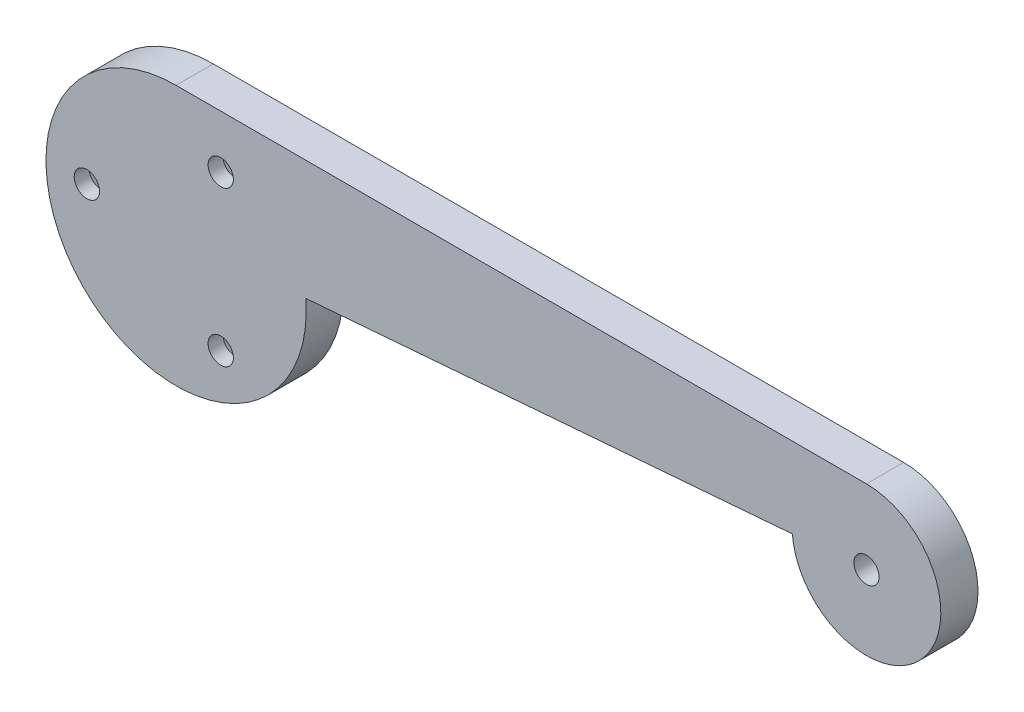
ISO-10303-21;
HEADER;
FILE_DESCRIPTION(('STEP AP214'),'2;1');
FILE_NAME('part.step','',(''),(''),'','','');
FILE_SCHEMA(('AUTOMOTIVE_DESIGN { 1 0 10303 214 1 1 1 1 }'));
ENDSEC;
DATA;
#1=APPLICATION_CONTEXT('core data for automotive mechanical design processes');
#2=APPLICATION_PROTOCOL_DEFINITION('international standard','automotive_design',2000,#1);
#3=PRODUCT_CONTEXT('',#1,'mechanical');
#4=PRODUCT('Part','Part','',(#3));
#5=PRODUCT_RELATED_PRODUCT_CATEGORY('part','',(#4));
#6=PRODUCT_DEFINITION_FORMATION('','',#4);
#7=PRODUCT_DEFINITION_CONTEXT('part definition',#1,'design');
#8=PRODUCT_DEFINITION('design','',#6,#7);
#9=PRODUCT_DEFINITION_SHAPE('','',#8);
#10=(LENGTH_UNIT() NAMED_UNIT(*) SI_UNIT(.MILLI.,.METRE.));
#11=(NAMED_UNIT(*) PLANE_ANGLE_UNIT() SI_UNIT($,.RADIAN.));
#12=(NAMED_UNIT(*) SI_UNIT($,.STERADIAN.) SOLID_ANGLE_UNIT());
#13=UNCERTAINTY_MEASURE_WITH_UNIT(LENGTH_MEASURE(1.E-05),#10,'distance_accuracy_value','');
#14=(GEOMETRIC_REPRESENTATION_CONTEXT(3) GLOBAL_UNCERTAINTY_ASSIGNED_CONTEXT((#13)) GLOBAL_UNIT_ASSIGNED_CONTEXT((#10,
#11,#12)) REPRESENTATION_CONTEXT('',''));
#15=CARTESIAN_POINT('',(0.,0.,0.));
#16=DIRECTION('',(0.,0.,1.));
#17=DIRECTION('',(1.,0.,0.));
#18=AXIS2_PLACEMENT_3D('',#15,#16,#17);
#19=CARTESIAN_POINT('',(0.,0.,0.));
#20=DIRECTION('',(0.,0.,1.));
#21=DIRECTION('',(1.,0.,0.));
#22=AXIS2_PLACEMENT_3D('',#19,#20,#21);
#23=PLANE('',#22);
#24=CARTESIAN_POINT('',(92.8256871756229,7.5,0.));
#25=DIRECTION('',(0.,0.,1.));
#26=DIRECTION('',(1.,0.,0.));
#27=AXIS2_PLACEMENT_3D('',#24,#25,#26);
#28=CIRCLE('',#27,1.69999999999999);
#29=CARTESIAN_POINT('',(94.5256871756229,7.5,0.));
#30=VERTEX_POINT('',#29);
#31=EDGE_CURVE('E473',#30,#30,#28,.T.);
#32=ORIENTED_EDGE('',*,*,#31,.T.);
#33=EDGE_LOOP('',(#32));
#34=FACE_BOUND('',#33,.T.);
#35=DIRECTION('',(1.,0.,0.));
#36=VECTOR('',#35,1.);
#37=CARTESIAN_POINT('',(4.38341924626908,7.59230484541324,0.));
#38=LINE('',#37,#36);
#39=CARTESIAN_POINT('',(4.38341924626908,7.59230484541324,0.));
#40=VERTEX_POINT('',#39);
#41=CARTESIAN_POINT('',(7.61658075373099,7.59230484541323,0.));
#42=VERTEX_POINT('',#41);
#43=EDGE_CURVE('E58',#40,#42,#38,.T.);
#44=ORIENTED_EDGE('',*,*,#43,.T.);
#45=DIRECTION('',(0.500000000000004,0.866025403784436,0.));
#46=VECTOR('',#45,1.);
#47=CARTESIAN_POINT('',(7.61658075373099,7.59230484541323,0.));
#48=LINE('',#47,#46);
#49=CARTESIAN_POINT('',(9.23316150746195,10.3923048454132,0.));
#50=VERTEX_POINT('',#49);
#51=EDGE_CURVE('E231',#42,#50,#48,.T.);
#52=ORIENTED_EDGE('',*,*,#51,.T.);
#53=DIRECTION('',(-0.499999999999996,0.866025403784441,0.));
#54=VECTOR('',#53,1.);
#55=CARTESIAN_POINT('',(9.23316150746195,10.3923048454132,0.));
#56=LINE('',#55,#54);
#57=CARTESIAN_POINT('',(7.61658075373101,13.1923048454132,0.));
#58=VERTEX_POINT('',#57);
#59=EDGE_CURVE('E234',#50,#58,#56,.T.);
#60=ORIENTED_EDGE('',*,*,#59,.T.);
#61=DIRECTION('',(-1.,0.,0.));
#62=VECTOR('',#61,1.);
#63=CARTESIAN_POINT('',(7.61658075373101,13.1923048454132,0.));
#64=LINE('',#63,#62);
#65=CARTESIAN_POINT('',(4.38341924626911,13.1923048454132,0.));
#66=VERTEX_POINT('',#65);
#67=EDGE_CURVE('E237',#58,#66,#64,.T.);
#68=ORIENTED_EDGE('',*,*,#67,.T.);
#69=DIRECTION('',(-0.500000000000004,-0.866025403784436,0.));
#70=VECTOR('',#69,1.);
#71=CARTESIAN_POINT('',(4.38341924626911,13.1923048454132,0.));
#72=LINE('',#71,#70);
#73=CARTESIAN_POINT('',(2.76683849253814,10.3923048454133,0.));
#74=VERTEX_POINT('',#73);
#75=EDGE_CURVE('E240',#66,#74,#72,.T.);
#76=ORIENTED_EDGE('',*,*,#75,.T.);
#77=DIRECTION('',(0.499999999999995,-0.866025403784441,0.));
#78=VECTOR('',#77,1.);
#79=CARTESIAN_POINT('',(2.76683849253814,10.3923048454133,0.));
#80=LINE('',#79,#78);
#81=EDGE_CURVE('E219',#74,#40,#80,.T.);
#82=ORIENTED_EDGE('',*,*,#81,.T.);
#83=EDGE_LOOP('',(#44,#52,#60,#68,#76,#82));
#84=FACE_BOUND('',#83,.T.);
#85=CARTESIAN_POINT('',(0.,0.,0.));
#86=DIRECTION('',(0.,0.,1.));
#87=DIRECTION('',(1.,0.,0.));
#88=AXIS2_PLACEMENT_3D('',#85,#86,#87);
#89=CIRCLE('',#88,17.5);
#90=CARTESIAN_POINT('',(0.,17.5,0.));
#91=VERTEX_POINT('',#90);
#92=CARTESIAN_POINT('',(17.4431573607474,1.40934782371281,0.));
#93=VERTEX_POINT('',#92);
#94=EDGE_CURVE('E312',#91,#93,#89,.T.);
#95=ORIENTED_EDGE('',*,*,#94,.F.);
#96=DIRECTION('',(-1.,0.,0.));
#97=VECTOR('',#96,1.);
#98=CARTESIAN_POINT('',(0.,17.5,0.));
#99=LINE('',#98,#97);
#100=CARTESIAN_POINT('',(92.8256871756229,17.5,0.));
#101=VERTEX_POINT('',#100);
#102=EDGE_CURVE('E317',#101,#91,#99,.T.);
#103=ORIENTED_EDGE('',*,*,#102,.F.);
#104=CARTESIAN_POINT('',(92.8256871756229,7.5,0.));
#105=DIRECTION('',(0.,0.,1.));
#106=DIRECTION('',(-1.,0.,0.));
#107=AXIS2_PLACEMENT_3D('',#104,#105,#106);
#108=CIRCLE('',#107,10.);
#109=CARTESIAN_POINT('',(82.8581686837672,6.69465838644989,0.));
#110=VERTEX_POINT('',#109);
#111=EDGE_CURVE('E328',#110,#101,#108,.T.);
#112=ORIENTED_EDGE('',*,*,#111,.F.);
#113=DIRECTION('',(0.996751849185565,0.0805341613550145,0.));
#114=VECTOR('',#113,1.);
#115=CARTESIAN_POINT('',(17.4431573607474,1.40934782371281,0.));
#116=LINE('',#115,#114);
#117=EDGE_CURVE('E326',#93,#110,#116,.T.);
#118=ORIENTED_EDGE('',*,*,#117,.F.);
#119=EDGE_LOOP('',(#95,#103,#112,#118));
#120=FACE_BOUND('',#119,.T.);
#121=DIRECTION('',(-0.500000000000001,0.866025403784438,0.));
#122=VECTOR('',#121,1.);
#123=CARTESIAN_POINT('',(-8.76683849253809,0.,0.));
#124=LINE('',#123,#122);
#125=CARTESIAN_POINT('',(-8.76683849253809,0.,0.));
#126=VERTEX_POINT('',#125);
#127=CARTESIAN_POINT('',(-10.383419246269,2.8,0.));
#128=VERTEX_POINT('',#127);
#129=EDGE_CURVE('E263',#126,#128,#124,.T.);
#130=ORIENTED_EDGE('',*,*,#129,.T.);
#131=DIRECTION('',(-1.,0.,0.));
#132=VECTOR('',#131,1.);
#133=CARTESIAN_POINT('',(-10.383419246269,2.8,0.));
#134=LINE('',#133,#132);
#135=CARTESIAN_POINT('',(-13.616580753731,2.8,0.));
#136=VERTEX_POINT('',#135);
#137=EDGE_CURVE('E281',#128,#136,#134,.T.);
#138=ORIENTED_EDGE('',*,*,#137,.T.);
#139=DIRECTION('',(-0.5,-0.866025403784438,0.));
#140=VECTOR('',#139,1.);
#141=CARTESIAN_POINT('',(-13.616580753731,2.8,0.));
#142=LINE('',#141,#140);
#143=CARTESIAN_POINT('',(-15.2331615074619,0.,0.));
#144=VERTEX_POINT('',#143);
#145=EDGE_CURVE('E284',#136,#144,#142,.T.);
#146=ORIENTED_EDGE('',*,*,#145,.T.);
#147=DIRECTION('',(0.5,-0.866025403784438,0.));
#148=VECTOR('',#147,1.);
#149=CARTESIAN_POINT('',(-15.2331615074619,0.,0.));
#150=LINE('',#149,#148);
#151=CARTESIAN_POINT('',(-13.616580753731,-2.8,0.));
#152=VERTEX_POINT('',#151);
#153=EDGE_CURVE('E287',#144,#152,#150,.T.);
#154=ORIENTED_EDGE('',*,*,#153,.T.);
#155=DIRECTION('',(1.,0.,0.));
#156=VECTOR('',#155,1.);
#157=CARTESIAN_POINT('',(-13.616580753731,-2.8,0.));
#158=LINE('',#157,#156);
#159=CARTESIAN_POINT('',(-10.383419246269,-2.8,0.));
#160=VERTEX_POINT('',#159);
#161=EDGE_CURVE('E290',#152,#160,#158,.T.);
#162=ORIENTED_EDGE('',*,*,#161,.T.);
#163=DIRECTION('',(0.500000000000001,0.866025403784438,0.));
#164=VECTOR('',#163,1.);
#165=CARTESIAN_POINT('',(-10.383419246269,-2.8,0.));
#166=LINE('',#165,#164);
#167=EDGE_CURVE('E268',#160,#126,#166,.T.);
#168=ORIENTED_EDGE('',*,*,#167,.T.);
#169=EDGE_LOOP('',(#130,#138,#146,#154,#162,#168));
#170=FACE_BOUND('',#169,.T.);
#171=DIRECTION('',(-0.500000000000008,-0.866025403784434,0.));
#172=VECTOR('',#171,1.);
#173=CARTESIAN_POINT('',(4.38341924626897,-7.5923048454133,0.));
#174=LINE('',#173,#172);
#175=CARTESIAN_POINT('',(4.38341924626897,-7.5923048454133,0.));
#176=VERTEX_POINT('',#175);
#177=CARTESIAN_POINT('',(2.766838492538,-10.3923048454133,0.));
#178=VERTEX_POINT('',#177);
#179=EDGE_CURVE('E50',#176,#178,#174,.T.);
#180=ORIENTED_EDGE('',*,*,#179,.T.);
#181=DIRECTION('',(0.499999999999992,-0.866025403784443,0.));
#182=VECTOR('',#181,1.);
#183=CARTESIAN_POINT('',(2.766838492538,-10.3923048454133,0.));
#184=LINE('',#183,#182);
#185=CARTESIAN_POINT('',(4.38341924626893,-13.1923048454133,0.));
#186=VERTEX_POINT('',#185);
#187=EDGE_CURVE('E207',#178,#186,#184,.T.);
#188=ORIENTED_EDGE('',*,*,#187,.T.);
#189=DIRECTION('',(1.,0.,0.));
#190=VECTOR('',#189,1.);
#191=CARTESIAN_POINT('',(4.38341924626893,-13.1923048454133,0.));
#192=LINE('',#191,#190);
#193=CARTESIAN_POINT('',(7.61658075373083,-13.1923048454133,0.));
#194=VERTEX_POINT('',#193);
#195=EDGE_CURVE('E475',#186,#194,#192,.T.);
#196=ORIENTED_EDGE('',*,*,#195,.T.);
#197=DIRECTION('',(0.500000000000008,0.866025403784434,0.));
#198=VECTOR('',#197,1.);
#199=CARTESIAN_POINT('',(7.61658075373083,-13.1923048454133,0.));
#200=LINE('',#199,#198);
#201=CARTESIAN_POINT('',(9.23316150746181,-10.3923048454134,0.));
#202=VERTEX_POINT('',#201);
#203=EDGE_CURVE('E483',#194,#202,#200,.T.);
#204=ORIENTED_EDGE('',*,*,#203,.T.);
#205=DIRECTION('',(-0.499999999999992,0.866025403784443,0.));
#206=VECTOR('',#205,1.);
#207=CARTESIAN_POINT('',(9.23316150746181,-10.3923048454134,0.));
#208=LINE('',#207,#206);
#209=CARTESIAN_POINT('',(7.61658075373088,-7.59230484541333,0.));
#210=VERTEX_POINT('',#209);
#211=EDGE_CURVE('E486',#202,#210,#208,.T.);
#212=ORIENTED_EDGE('',*,*,#211,.T.);
#213=DIRECTION('',(-1.,0.,0.));
#214=VECTOR('',#213,1.);
#215=CARTESIAN_POINT('',(7.61658075373088,-7.59230484541333,0.));
#216=LINE('',#215,#214);
#217=EDGE_CURVE('E203',#210,#176,#216,.T.);
#218=ORIENTED_EDGE('',*,*,#217,.T.);
#219=EDGE_LOOP('',(#180,#188,#196,#204,#212,#218));
#220=FACE_BOUND('',#219,.T.);
#221=ADVANCED_FACE('F33',(#34,#84,#120,#170,#220),#23,.F.);
#222=CARTESIAN_POINT('',(0.,0.,5.));
#223=DIRECTION('',(0.,0.,-1.));
#224=DIRECTION('',(-1.,0.,0.));
#225=AXIS2_PLACEMENT_3D('',#222,#223,#224);
#226=CYLINDRICAL_SURFACE('',#225,17.5);
#227=ORIENTED_EDGE('',*,*,#94,.T.);
#228=DIRECTION('',(0.,0.,-1.));
#229=VECTOR('',#228,1.);
#230=CARTESIAN_POINT('',(17.4431573607474,1.40934782371281,5.));
#231=LINE('',#230,#229);
#232=CARTESIAN_POINT('',(17.4431573607474,1.40934782371281,5.));
#233=VERTEX_POINT('',#232);
#234=EDGE_CURVE('E11',#233,#93,#231,.T.);
#235=ORIENTED_EDGE('',*,*,#234,.F.);
#236=CARTESIAN_POINT('',(0.,0.,5.));
#237=DIRECTION('',(0.,0.,1.));
#238=DIRECTION('',(1.,0.,0.));
#239=AXIS2_PLACEMENT_3D('',#236,#237,#238);
#240=CIRCLE('',#239,17.5);
#241=CARTESIAN_POINT('',(0.,17.5,5.));
#242=VERTEX_POINT('',#241);
#243=EDGE_CURVE('E313',#242,#233,#240,.T.);
#244=ORIENTED_EDGE('',*,*,#243,.F.);
#245=DIRECTION('',(0.,0.,-1.));
#246=VECTOR('',#245,1.);
#247=CARTESIAN_POINT('',(0.,17.5,5.));
#248=LINE('',#247,#246);
#249=EDGE_CURVE('E323',#242,#91,#248,.T.);
#250=ORIENTED_EDGE('',*,*,#249,.T.);
#251=EDGE_LOOP('',(#227,#235,#244,#250));
#252=FACE_BOUND('',#251,.T.);
#253=ADVANCED_FACE('F35',(#252),#226,.T.);
#254=CARTESIAN_POINT('',(17.4431573607474,1.40934782371281,5.));
#255=DIRECTION('',(-0.0805341613550145,0.996751849185566,0.));
#256=DIRECTION('',(-0.996751849185566,-0.0805341613550145,0.));
#257=AXIS2_PLACEMENT_3D('',#254,#255,#256);
#258=PLANE('',#257);
#259=ORIENTED_EDGE('',*,*,#117,.T.);
#260=DIRECTION('',(0.,0.,-1.));
#261=VECTOR('',#260,1.);
#262=CARTESIAN_POINT('',(82.8581686837672,6.69465838644989,5.));
#263=LINE('',#262,#261);
#264=CARTESIAN_POINT('',(82.8581686837672,6.69465838644989,5.));
#265=VERTEX_POINT('',#264);
#266=EDGE_CURVE('E42',#265,#110,#263,.T.);
#267=ORIENTED_EDGE('',*,*,#266,.F.);
#268=DIRECTION('',(0.996751849185565,0.0805341613550145,0.));
#269=VECTOR('',#268,1.);
#270=CARTESIAN_POINT('',(17.4431573607474,1.40934782371281,5.));
#271=LINE('',#270,#269);
#272=EDGE_CURVE('E316',#233,#265,#271,.T.);
#273=ORIENTED_EDGE('',*,*,#272,.F.);
#274=ORIENTED_EDGE('',*,*,#234,.T.);
#275=EDGE_LOOP('',(#259,#267,#273,#274));
#276=FACE_BOUND('',#275,.T.);
#277=ADVANCED_FACE('F368',(#276),#258,.F.);
#278=CARTESIAN_POINT('',(92.8256871756229,7.5,5.));
#279=DIRECTION('',(0.,0.,-1.));
#280=DIRECTION('',(-1.,0.,0.));
#281=AXIS2_PLACEMENT_3D('',#278,#279,#280);
#282=CYLINDRICAL_SURFACE('',#281,10.);
#283=ORIENTED_EDGE('',*,*,#111,.T.);
#284=DIRECTION('',(0.,0.,-1.));
#285=VECTOR('',#284,1.);
#286=CARTESIAN_POINT('',(92.8256871756229,17.5,5.));
#287=LINE('',#286,#285);
#288=CARTESIAN_POINT('',(92.8256871756229,17.5,5.));
#289=VERTEX_POINT('',#288);
#290=EDGE_CURVE('E333',#289,#101,#287,.T.);
#291=ORIENTED_EDGE('',*,*,#290,.F.);
#292=CARTESIAN_POINT('',(92.8256871756229,7.5,5.));
#293=DIRECTION('',(0.,0.,1.));
#294=DIRECTION('',(-1.,0.,0.));
#295=AXIS2_PLACEMENT_3D('',#292,#293,#294);
#296=CIRCLE('',#295,10.);
#297=EDGE_CURVE('E319',#265,#289,#296,.T.);
#298=ORIENTED_EDGE('',*,*,#297,.F.);
#299=ORIENTED_EDGE('',*,*,#266,.T.);
#300=EDGE_LOOP('',(#283,#291,#298,#299));
#301=FACE_BOUND('',#300,.T.);
#302=ADVANCED_FACE('F379',(#301),#282,.T.);
#303=CARTESIAN_POINT('',(0.,17.5,5.));
#304=DIRECTION('',(0.,-1.,0.));
#305=DIRECTION('',(0.,0.,-1.));
#306=AXIS2_PLACEMENT_3D('',#303,#304,#305);
#307=PLANE('',#306);
#308=ORIENTED_EDGE('',*,*,#102,.T.);
#309=ORIENTED_EDGE('',*,*,#249,.F.);
#310=DIRECTION('',(-1.,0.,0.));
#311=VECTOR('',#310,1.);
#312=CARTESIAN_POINT('',(0.,17.5,5.));
#313=LINE('',#312,#311);
#314=EDGE_CURVE('E321',#289,#242,#313,.T.);
#315=ORIENTED_EDGE('',*,*,#314,.F.);
#316=ORIENTED_EDGE('',*,*,#290,.T.);
#317=EDGE_LOOP('',(#308,#309,#315,#316));
#318=FACE_BOUND('',#317,.T.);
#319=ADVANCED_FACE('F376',(#318),#307,.F.);
#320=CARTESIAN_POINT('',(0.,0.,5.));
#321=DIRECTION('',(0.,0.,1.));
#322=DIRECTION('',(1.,0.,0.));
#323=AXIS2_PLACEMENT_3D('',#320,#321,#322);
#324=PLANE('',#323);
#325=CARTESIAN_POINT('',(92.8256871756229,7.5,5.));
#326=DIRECTION('',(0.,0.,1.));
#327=DIRECTION('',(1.,0.,0.));
#328=AXIS2_PLACEMENT_3D('',#325,#326,#327);
#329=CIRCLE('',#328,1.69999999999999);
#330=CARTESIAN_POINT('',(94.5256871756229,7.5,5.));
#331=VERTEX_POINT('',#330);
#332=EDGE_CURVE('E411',#331,#331,#329,.T.);
#333=ORIENTED_EDGE('',*,*,#332,.F.);
#334=EDGE_LOOP('',(#333));
#335=FACE_BOUND('',#334,.T.);
#336=CARTESIAN_POINT('',(5.9999999999999,-10.3923048454133,5.));
#337=DIRECTION('',(0.,0.,1.));
#338=DIRECTION('',(1.,0.,0.));
#339=AXIS2_PLACEMENT_3D('',#336,#337,#338);
#340=CIRCLE('',#339,1.69999999999999);
#341=CARTESIAN_POINT('',(7.69999999999989,-10.3923048454133,5.));
#342=VERTEX_POINT('',#341);
#343=EDGE_CURVE('E257',#342,#342,#340,.T.);
#344=ORIENTED_EDGE('',*,*,#343,.F.);
#345=EDGE_LOOP('',(#344));
#346=FACE_BOUND('',#345,.T.);
#347=CARTESIAN_POINT('',(6.00000000000005,10.3923048454132,5.));
#348=DIRECTION('',(0.,0.,1.));
#349=DIRECTION('',(1.,0.,0.));
#350=AXIS2_PLACEMENT_3D('',#347,#348,#349);
#351=CIRCLE('',#350,1.69999999999999);
#352=CARTESIAN_POINT('',(7.70000000000004,10.3923048454132,5.));
#353=VERTEX_POINT('',#352);
#354=EDGE_CURVE('E260',#353,#353,#351,.T.);
#355=ORIENTED_EDGE('',*,*,#354,.F.);
#356=EDGE_LOOP('',(#355));
#357=FACE_BOUND('',#356,.T.);
#358=CARTESIAN_POINT('',(-12.,0.,5.));
#359=DIRECTION('',(0.,0.,1.));
#360=DIRECTION('',(1.,0.,0.));
#361=AXIS2_PLACEMENT_3D('',#358,#359,#360);
#362=CIRCLE('',#361,1.69999999999999);
#363=CARTESIAN_POINT('',(-10.3,0.,5.));
#364=VERTEX_POINT('',#363);
#365=EDGE_CURVE('E309',#364,#364,#362,.T.);
#366=ORIENTED_EDGE('',*,*,#365,.F.);
#367=EDGE_LOOP('',(#366));
#368=FACE_BOUND('',#367,.T.);
#369=ORIENTED_EDGE('',*,*,#243,.T.);
#370=ORIENTED_EDGE('',*,*,#272,.T.);
#371=ORIENTED_EDGE('',*,*,#297,.T.);
#372=ORIENTED_EDGE('',*,*,#314,.T.);
#373=EDGE_LOOP('',(#369,#370,#371,#372));
#374=FACE_BOUND('',#373,.T.);
#375=ADVANCED_FACE('F374',(#335,#346,#357,#368,#374),#324,.T.);
#376=CARTESIAN_POINT('',(-12.,0.,5.));
#377=DIRECTION('',(0.,0.,1.));
#378=DIRECTION('',(1.,0.,0.));
#379=AXIS2_PLACEMENT_3D('',#376,#377,#378);
#380=CYLINDRICAL_SURFACE('',#379,1.69999999999999);
#381=CARTESIAN_POINT('',(-12.,0.,3.));
#382=DIRECTION('',(0.,0.,1.));
#383=DIRECTION('',(1.,0.,0.));
#384=AXIS2_PLACEMENT_3D('',#381,#382,#383);
#385=CIRCLE('',#384,1.69999999999999);
#386=CARTESIAN_POINT('',(-10.3,0.,3.));
#387=VERTEX_POINT('',#386);
#388=EDGE_CURVE('E308',#387,#387,#385,.F.);
#389=ORIENTED_EDGE('',*,*,#388,.T.);
#390=EDGE_LOOP('',(#389));
#391=FACE_BOUND('',#390,.T.);
#392=ORIENTED_EDGE('',*,*,#365,.T.);
#393=EDGE_LOOP('',(#392));
#394=FACE_BOUND('',#393,.T.);
#395=ADVANCED_FACE('F401',(#391,#394),#380,.F.);
#396=CARTESIAN_POINT('',(0.,0.,3.));
#397=DIRECTION('',(0.,0.,1.));
#398=DIRECTION('',(1.,0.,0.));
#399=AXIS2_PLACEMENT_3D('',#396,#397,#398);
#400=PLANE('',#399);
#401=DIRECTION('',(-0.500000000000001,0.866025403784438,0.));
#402=VECTOR('',#401,1.);
#403=CARTESIAN_POINT('',(-8.76683849253809,0.,3.));
#404=LINE('',#403,#402);
#405=CARTESIAN_POINT('',(-8.76683849253809,0.,3.));
#406=VERTEX_POINT('',#405);
#407=CARTESIAN_POINT('',(-10.383419246269,2.8,3.));
#408=VERTEX_POINT('',#407);
#409=EDGE_CURVE('E264',#406,#408,#404,.T.);
#410=ORIENTED_EDGE('',*,*,#409,.F.);
#411=DIRECTION('',(0.500000000000001,0.866025403784438,0.));
#412=VECTOR('',#411,1.);
#413=CARTESIAN_POINT('',(-10.383419246269,-2.8,3.));
#414=LINE('',#413,#412);
#415=CARTESIAN_POINT('',(-10.383419246269,-2.8,3.));
#416=VERTEX_POINT('',#415);
#417=EDGE_CURVE('E276',#416,#406,#414,.T.);
#418=ORIENTED_EDGE('',*,*,#417,.F.);
#419=DIRECTION('',(1.,0.,0.));
#420=VECTOR('',#419,1.);
#421=CARTESIAN_POINT('',(-13.616580753731,-2.8,3.));
#422=LINE('',#421,#420);
#423=CARTESIAN_POINT('',(-13.616580753731,-2.8,3.));
#424=VERTEX_POINT('',#423);
#425=EDGE_CURVE('E274',#424,#416,#422,.T.);
#426=ORIENTED_EDGE('',*,*,#425,.F.);
#427=DIRECTION('',(0.5,-0.866025403784438,0.));
#428=VECTOR('',#427,1.);
#429=CARTESIAN_POINT('',(-15.2331615074619,0.,3.));
#430=LINE('',#429,#428);
#431=CARTESIAN_POINT('',(-15.2331615074619,0.,3.));
#432=VERTEX_POINT('',#431);
#433=EDGE_CURVE('E272',#432,#424,#430,.T.);
#434=ORIENTED_EDGE('',*,*,#433,.F.);
#435=DIRECTION('',(-0.5,-0.866025403784438,0.));
#436=VECTOR('',#435,1.);
#437=CARTESIAN_POINT('',(-13.616580753731,2.8,3.));
#438=LINE('',#437,#436);
#439=CARTESIAN_POINT('',(-13.616580753731,2.8,3.));
#440=VERTEX_POINT('',#439);
#441=EDGE_CURVE('E270',#440,#432,#438,.T.);
#442=ORIENTED_EDGE('',*,*,#441,.F.);
#443=DIRECTION('',(-1.,0.,0.));
#444=VECTOR('',#443,1.);
#445=CARTESIAN_POINT('',(-10.383419246269,2.8,3.));
#446=LINE('',#445,#444);
#447=EDGE_CURVE('E267',#408,#440,#446,.T.);
#448=ORIENTED_EDGE('',*,*,#447,.F.);
#449=EDGE_LOOP('',(#410,#418,#426,#434,#442,#448));
#450=FACE_BOUND('',#449,.T.);
#451=ORIENTED_EDGE('',*,*,#388,.F.);
#452=EDGE_LOOP('',(#451));
#453=FACE_BOUND('',#452,.T.);
#454=ADVANCED_FACE('F406',(#450,#453),#400,.F.);
#455=CARTESIAN_POINT('',(-8.76683849253809,0.,3.));
#456=DIRECTION('',(-0.866025403784438,-0.500000000000001,0.));
#457=DIRECTION('',(0.500000000000001,-0.866025403784438,0.));
#458=AXIS2_PLACEMENT_3D('',#455,#456,#457);
#459=PLANE('',#458);
#460=ORIENTED_EDGE('',*,*,#129,.F.);
#461=DIRECTION('',(0.,0.,-1.));
#462=VECTOR('',#461,1.);
#463=CARTESIAN_POINT('',(-8.76683849253809,0.,3.));
#464=LINE('',#463,#462);
#465=EDGE_CURVE('E278',#406,#126,#464,.T.);
#466=ORIENTED_EDGE('',*,*,#465,.F.);
#467=ORIENTED_EDGE('',*,*,#409,.T.);
#468=DIRECTION('',(0.,0.,-1.));
#469=VECTOR('',#468,1.);
#470=CARTESIAN_POINT('',(-10.383419246269,2.8,3.));
#471=LINE('',#470,#469);
#472=EDGE_CURVE('E305',#408,#128,#471,.T.);
#473=ORIENTED_EDGE('',*,*,#472,.T.);
#474=EDGE_LOOP('',(#460,#466,#467,#473));
#475=FACE_BOUND('',#474,.T.);
#476=ADVANCED_FACE('F429',(#475),#459,.T.);
#477=CARTESIAN_POINT('',(-10.383419246269,2.8,3.));
#478=DIRECTION('',(0.,-1.,0.));
#479=DIRECTION('',(0.,0.,-1.));
#480=AXIS2_PLACEMENT_3D('',#477,#478,#479);
#481=PLANE('',#480);
#482=ORIENTED_EDGE('',*,*,#137,.F.);
#483=ORIENTED_EDGE('',*,*,#472,.F.);
#484=ORIENTED_EDGE('',*,*,#447,.T.);
#485=DIRECTION('',(0.,0.,-1.));
#486=VECTOR('',#485,1.);
#487=CARTESIAN_POINT('',(-13.616580753731,2.8,3.));
#488=LINE('',#487,#486);
#489=EDGE_CURVE('E303',#440,#136,#488,.T.);
#490=ORIENTED_EDGE('',*,*,#489,.T.);
#491=EDGE_LOOP('',(#482,#483,#484,#490));
#492=FACE_BOUND('',#491,.T.);
#493=ADVANCED_FACE('F442',(#492),#481,.T.);
#494=CARTESIAN_POINT('',(-13.616580753731,2.8,3.));
#495=DIRECTION('',(0.866025403784439,-0.5,0.));
#496=DIRECTION('',(0.5,0.866025403784439,0.));
#497=AXIS2_PLACEMENT_3D('',#494,#495,#496);
#498=PLANE('',#497);
#499=ORIENTED_EDGE('',*,*,#145,.F.);
#500=ORIENTED_EDGE('',*,*,#489,.F.);
#501=ORIENTED_EDGE('',*,*,#441,.T.);
#502=DIRECTION('',(0.,0.,-1.));
#503=VECTOR('',#502,1.);
#504=CARTESIAN_POINT('',(-15.2331615074619,0.,3.));
#505=LINE('',#504,#503);
#506=EDGE_CURVE('E301',#432,#144,#505,.T.);
#507=ORIENTED_EDGE('',*,*,#506,.T.);
#508=EDGE_LOOP('',(#499,#500,#501,#507));
#509=FACE_BOUND('',#508,.T.);
#510=ADVANCED_FACE('F438',(#509),#498,.T.);
#511=CARTESIAN_POINT('',(-15.2331615074619,0.,3.));
#512=DIRECTION('',(0.866025403784439,0.5,0.));
#513=DIRECTION('',(-0.5,0.866025403784439,0.));
#514=AXIS2_PLACEMENT_3D('',#511,#512,#513);
#515=PLANE('',#514);
#516=ORIENTED_EDGE('',*,*,#153,.F.);
#517=ORIENTED_EDGE('',*,*,#506,.F.);
#518=ORIENTED_EDGE('',*,*,#433,.T.);
#519=DIRECTION('',(0.,0.,-1.));
#520=VECTOR('',#519,1.);
#521=CARTESIAN_POINT('',(-13.616580753731,-2.8,3.));
#522=LINE('',#521,#520);
#523=EDGE_CURVE('E299',#424,#152,#522,.T.);
#524=ORIENTED_EDGE('',*,*,#523,.T.);
#525=EDGE_LOOP('',(#516,#517,#518,#524));
#526=FACE_BOUND('',#525,.T.);
#527=ADVANCED_FACE('F434',(#526),#515,.T.);
#528=CARTESIAN_POINT('',(-13.616580753731,-2.8,3.));
#529=DIRECTION('',(0.,1.,0.));
#530=DIRECTION('',(0.,0.,1.));
#531=AXIS2_PLACEMENT_3D('',#528,#529,#530);
#532=PLANE('',#531);
#533=ORIENTED_EDGE('',*,*,#161,.F.);
#534=ORIENTED_EDGE('',*,*,#523,.F.);
#535=ORIENTED_EDGE('',*,*,#425,.T.);
#536=DIRECTION('',(0.,0.,-1.));
#537=VECTOR('',#536,1.);
#538=CARTESIAN_POINT('',(-10.383419246269,-2.8,3.));
#539=LINE('',#538,#537);
#540=EDGE_CURVE('E297',#416,#160,#539,.T.);
#541=ORIENTED_EDGE('',*,*,#540,.T.);
#542=EDGE_LOOP('',(#533,#534,#535,#541));
#543=FACE_BOUND('',#542,.T.);
#544=ADVANCED_FACE('F424',(#543),#532,.T.);
#545=CARTESIAN_POINT('',(-10.383419246269,-2.8,3.));
#546=DIRECTION('',(-0.866025403784438,0.500000000000001,0.));
#547=DIRECTION('',(-0.500000000000001,-0.866025403784438,0.));
#548=AXIS2_PLACEMENT_3D('',#545,#546,#547);
#549=PLANE('',#548);
#550=ORIENTED_EDGE('',*,*,#167,.F.);
#551=ORIENTED_EDGE('',*,*,#540,.F.);
#552=ORIENTED_EDGE('',*,*,#417,.T.);
#553=ORIENTED_EDGE('',*,*,#465,.T.);
#554=EDGE_LOOP('',(#550,#551,#552,#553));
#555=FACE_BOUND('',#554,.T.);
#556=ADVANCED_FACE('F419',(#555),#549,.T.);
#557=CARTESIAN_POINT('',(6.00000000000005,10.3923048454132,5.));
#558=DIRECTION('',(0.,0.,1.));
#559=DIRECTION('',(1.,0.,0.));
#560=AXIS2_PLACEMENT_3D('',#557,#558,#559);
#561=CYLINDRICAL_SURFACE('',#560,1.69999999999999);
#562=CARTESIAN_POINT('',(6.00000000000005,10.3923048454132,3.));
#563=DIRECTION('',(0.,0.,1.));
#564=DIRECTION('',(1.,0.,0.));
#565=AXIS2_PLACEMENT_3D('',#562,#563,#564);
#566=CIRCLE('',#565,1.69999999999999);
#567=CARTESIAN_POINT('',(7.70000000000004,10.3923048454132,3.));
#568=VERTEX_POINT('',#567);
#569=EDGE_CURVE('E256',#568,#568,#566,.F.);
#570=ORIENTED_EDGE('',*,*,#569,.T.);
#571=EDGE_LOOP('',(#570));
#572=FACE_BOUND('',#571,.T.);
#573=ORIENTED_EDGE('',*,*,#354,.T.);
#574=EDGE_LOOP('',(#573));
#575=FACE_BOUND('',#574,.T.);
#576=ADVANCED_FACE('F342',(#572,#575),#561,.F.);
#577=CARTESIAN_POINT('',(5.9999999999999,-10.3923048454133,5.));
#578=DIRECTION('',(0.,0.,1.));
#579=DIRECTION('',(1.,0.,0.));
#580=AXIS2_PLACEMENT_3D('',#577,#578,#579);
#581=CYLINDRICAL_SURFACE('',#580,1.69999999999999);
#582=CARTESIAN_POINT('',(5.9999999999999,-10.3923048454133,3.));
#583=DIRECTION('',(0.,0.,1.));
#584=DIRECTION('',(1.,0.,0.));
#585=AXIS2_PLACEMENT_3D('',#582,#583,#584);
#586=CIRCLE('',#585,1.69999999999999);
#587=CARTESIAN_POINT('',(7.6999999999999,-10.3923048454133,3.));
#588=VERTEX_POINT('',#587);
#589=EDGE_CURVE('E37',#588,#588,#586,.F.);
#590=ORIENTED_EDGE('',*,*,#589,.T.);
#591=EDGE_LOOP('',(#590));
#592=FACE_BOUND('',#591,.T.);
#593=ORIENTED_EDGE('',*,*,#343,.T.);
#594=EDGE_LOOP('',(#593));
#595=FACE_BOUND('',#594,.T.);
#596=ADVANCED_FACE('F348',(#592,#595),#581,.F.);
#597=CARTESIAN_POINT('',(0.,0.,3.));
#598=DIRECTION('',(0.,0.,1.));
#599=DIRECTION('',(-0.500000000000004,-0.866025403784436,0.));
#600=AXIS2_PLACEMENT_3D('',#597,#598,#599);
#601=PLANE('',#600);
#602=DIRECTION('',(1.,0.,0.));
#603=VECTOR('',#602,1.);
#604=CARTESIAN_POINT('',(4.38341924626908,7.59230484541324,3.));
#605=LINE('',#604,#603);
#606=CARTESIAN_POINT('',(4.38341924626908,7.59230484541324,3.));
#607=VERTEX_POINT('',#606);
#608=CARTESIAN_POINT('',(7.61658075373099,7.59230484541323,3.));
#609=VERTEX_POINT('',#608);
#610=EDGE_CURVE('E215',#607,#609,#605,.T.);
#611=ORIENTED_EDGE('',*,*,#610,.F.);
#612=DIRECTION('',(0.499999999999995,-0.866025403784441,0.));
#613=VECTOR('',#612,1.);
#614=CARTESIAN_POINT('',(2.76683849253814,10.3923048454133,3.));
#615=LINE('',#614,#613);
#616=CARTESIAN_POINT('',(2.76683849253814,10.3923048454133,3.));
#617=VERTEX_POINT('',#616);
#618=EDGE_CURVE('E227',#617,#607,#615,.T.);
#619=ORIENTED_EDGE('',*,*,#618,.F.);
#620=DIRECTION('',(-0.500000000000004,-0.866025403784436,0.));
#621=VECTOR('',#620,1.);
#622=CARTESIAN_POINT('',(4.38341924626911,13.1923048454132,3.));
#623=LINE('',#622,#621);
#624=CARTESIAN_POINT('',(4.38341924626911,13.1923048454132,3.));
#625=VERTEX_POINT('',#624);
#626=EDGE_CURVE('E225',#625,#617,#623,.T.);
#627=ORIENTED_EDGE('',*,*,#626,.F.);
#628=DIRECTION('',(-1.,0.,0.));
#629=VECTOR('',#628,1.);
#630=CARTESIAN_POINT('',(7.61658075373101,13.1923048454132,3.));
#631=LINE('',#630,#629);
#632=CARTESIAN_POINT('',(7.61658075373101,13.1923048454132,3.));
#633=VERTEX_POINT('',#632);
#634=EDGE_CURVE('E223',#633,#625,#631,.T.);
#635=ORIENTED_EDGE('',*,*,#634,.F.);
#636=DIRECTION('',(-0.499999999999996,0.866025403784441,0.));
#637=VECTOR('',#636,1.);
#638=CARTESIAN_POINT('',(9.23316150746195,10.3923048454132,3.));
#639=LINE('',#638,#637);
#640=CARTESIAN_POINT('',(9.23316150746195,10.3923048454132,3.));
#641=VERTEX_POINT('',#640);
#642=EDGE_CURVE('E221',#641,#633,#639,.T.);
#643=ORIENTED_EDGE('',*,*,#642,.F.);
#644=DIRECTION('',(0.500000000000004,0.866025403784436,0.));
#645=VECTOR('',#644,1.);
#646=CARTESIAN_POINT('',(7.61658075373099,7.59230484541323,3.));
#647=LINE('',#646,#645);
#648=EDGE_CURVE('E218',#609,#641,#647,.T.);
#649=ORIENTED_EDGE('',*,*,#648,.F.);
#650=EDGE_LOOP('',(#611,#619,#627,#635,#643,#649));
#651=FACE_BOUND('',#650,.T.);
#652=ORIENTED_EDGE('',*,*,#569,.F.);
#653=EDGE_LOOP('',(#652));
#654=FACE_BOUND('',#653,.T.);
#655=ADVANCED_FACE('F345',(#651,#654),#601,.F.);
#656=CARTESIAN_POINT('',(4.38341924626908,7.59230484541324,3.));
#657=DIRECTION('',(0.,1.,0.));
#658=DIRECTION('',(-1.,0.,0.));
#659=AXIS2_PLACEMENT_3D('',#656,#657,#658);
#660=PLANE('',#659);
#661=ORIENTED_EDGE('',*,*,#43,.F.);
#662=DIRECTION('',(0.,0.,-1.));
#663=VECTOR('',#662,1.);
#664=CARTESIAN_POINT('',(4.38341924626908,7.59230484541324,3.));
#665=LINE('',#664,#663);
#666=EDGE_CURVE('E229',#607,#40,#665,.T.);
#667=ORIENTED_EDGE('',*,*,#666,.F.);
#668=ORIENTED_EDGE('',*,*,#610,.T.);
#669=DIRECTION('',(0.,0.,-1.));
#670=VECTOR('',#669,1.);
#671=CARTESIAN_POINT('',(7.61658075373099,7.59230484541323,3.));
#672=LINE('',#671,#670);
#673=EDGE_CURVE('E254',#609,#42,#672,.T.);
#674=ORIENTED_EDGE('',*,*,#673,.T.);
#675=EDGE_LOOP('',(#661,#667,#668,#674));
#676=FACE_BOUND('',#675,.T.);
#677=ADVANCED_FACE('F347',(#676),#660,.T.);
#678=CARTESIAN_POINT('',(7.61658075373099,7.59230484541323,3.));
#679=DIRECTION('',(-0.866025403784436,0.500000000000004,0.));
#680=DIRECTION('',(-0.500000000000004,-0.866025403784436,0.));
#681=AXIS2_PLACEMENT_3D('',#678,#679,#680);
#682=PLANE('',#681);
#683=ORIENTED_EDGE('',*,*,#51,.F.);
#684=ORIENTED_EDGE('',*,*,#673,.F.);
#685=ORIENTED_EDGE('',*,*,#648,.T.);
#686=DIRECTION('',(0.,0.,-1.));
#687=VECTOR('',#686,1.);
#688=CARTESIAN_POINT('',(9.23316150746195,10.3923048454132,3.));
#689=LINE('',#688,#687);
#690=EDGE_CURVE('E252',#641,#50,#689,.T.);
#691=ORIENTED_EDGE('',*,*,#690,.T.);
#692=EDGE_LOOP('',(#683,#684,#685,#691));
#693=FACE_BOUND('',#692,.T.);
#694=ADVANCED_FACE('F355',(#693),#682,.T.);
#695=CARTESIAN_POINT('',(9.23316150746195,10.3923048454132,3.));
#696=DIRECTION('',(-0.866025403784441,-0.499999999999996,0.));
#697=DIRECTION('',(0.499999999999996,-0.866025403784441,0.));
#698=AXIS2_PLACEMENT_3D('',#695,#696,#697);
#699=PLANE('',#698);
#700=ORIENTED_EDGE('',*,*,#59,.F.);
#701=ORIENTED_EDGE('',*,*,#690,.F.);
#702=ORIENTED_EDGE('',*,*,#642,.T.);
#703=DIRECTION('',(0.,0.,-1.));
#704=VECTOR('',#703,1.);
#705=CARTESIAN_POINT('',(7.61658075373101,13.1923048454132,3.));
#706=LINE('',#705,#704);
#707=EDGE_CURVE('E250',#633,#58,#706,.T.);
#708=ORIENTED_EDGE('',*,*,#707,.T.);
#709=EDGE_LOOP('',(#700,#701,#702,#708));
#710=FACE_BOUND('',#709,.T.);
#711=ADVANCED_FACE('F645',(#710),#699,.T.);
#712=CARTESIAN_POINT('',(7.61658075373101,13.1923048454132,3.));
#713=DIRECTION('',(0.,-1.,0.));
#714=DIRECTION('',(1.,0.,0.));
#715=AXIS2_PLACEMENT_3D('',#712,#713,#714);
#716=PLANE('',#715);
#717=ORIENTED_EDGE('',*,*,#67,.F.);
#718=ORIENTED_EDGE('',*,*,#707,.F.);
#719=ORIENTED_EDGE('',*,*,#634,.T.);
#720=DIRECTION('',(0.,0.,-1.));
#721=VECTOR('',#720,1.);
#722=CARTESIAN_POINT('',(4.38341924626911,13.1923048454132,3.));
#723=LINE('',#722,#721);
#724=EDGE_CURVE('E248',#625,#66,#723,.T.);
#725=ORIENTED_EDGE('',*,*,#724,.T.);
#726=EDGE_LOOP('',(#717,#718,#719,#725));
#727=FACE_BOUND('',#726,.T.);
#728=ADVANCED_FACE('F655',(#727),#716,.T.);
#729=CARTESIAN_POINT('',(4.38341924626911,13.1923048454132,3.));
#730=DIRECTION('',(0.866025403784436,-0.500000000000004,0.));
#731=DIRECTION('',(0.500000000000004,0.866025403784436,0.));
#732=AXIS2_PLACEMENT_3D('',#729,#730,#731);
#733=PLANE('',#732);
#734=ORIENTED_EDGE('',*,*,#75,.F.);
#735=ORIENTED_EDGE('',*,*,#724,.F.);
#736=ORIENTED_EDGE('',*,*,#626,.T.);
#737=DIRECTION('',(0.,0.,-1.));
#738=VECTOR('',#737,1.);
#739=CARTESIAN_POINT('',(2.76683849253814,10.3923048454133,3.));
#740=LINE('',#739,#738);
#741=EDGE_CURVE('E246',#617,#74,#740,.T.);
#742=ORIENTED_EDGE('',*,*,#741,.T.);
#743=EDGE_LOOP('',(#734,#735,#736,#742));
#744=FACE_BOUND('',#743,.T.);
#745=ADVANCED_FACE('F665',(#744),#733,.T.);
#746=CARTESIAN_POINT('',(2.76683849253814,10.3923048454133,3.));
#747=DIRECTION('',(0.866025403784441,0.499999999999995,0.));
#748=DIRECTION('',(-0.499999999999995,0.866025403784441,0.));
#749=AXIS2_PLACEMENT_3D('',#746,#747,#748);
#750=PLANE('',#749);
#751=ORIENTED_EDGE('',*,*,#81,.F.);
#752=ORIENTED_EDGE('',*,*,#741,.F.);
#753=ORIENTED_EDGE('',*,*,#618,.T.);
#754=ORIENTED_EDGE('',*,*,#666,.T.);
#755=EDGE_LOOP('',(#751,#752,#753,#754));
#756=FACE_BOUND('',#755,.T.);
#757=ADVANCED_FACE('F525',(#756),#750,.T.);
#758=CARTESIAN_POINT('',(0.,0.,3.));
#759=DIRECTION('',(0.,0.,1.));
#760=DIRECTION('',(-0.499999999999992,0.866025403784443,0.));
#761=AXIS2_PLACEMENT_3D('',#758,#759,#760);
#762=PLANE('',#761);
#763=DIRECTION('',(-0.500000000000008,-0.866025403784434,0.));
#764=VECTOR('',#763,1.);
#765=CARTESIAN_POINT('',(4.38341924626897,-7.5923048454133,3.));
#766=LINE('',#765,#764);
#767=CARTESIAN_POINT('',(4.38341924626897,-7.5923048454133,3.));
#768=VERTEX_POINT('',#767);
#769=CARTESIAN_POINT('',(2.766838492538,-10.3923048454133,3.));
#770=VERTEX_POINT('',#769);
#771=EDGE_CURVE('E193',#768,#770,#766,.T.);
#772=ORIENTED_EDGE('',*,*,#771,.F.);
#773=DIRECTION('',(-1.,0.,0.));
#774=VECTOR('',#773,1.);
#775=CARTESIAN_POINT('',(7.61658075373088,-7.59230484541333,3.));
#776=LINE('',#775,#774);
#777=CARTESIAN_POINT('',(7.61658075373088,-7.59230484541333,3.));
#778=VERTEX_POINT('',#777);
#779=EDGE_CURVE('E479',#778,#768,#776,.T.);
#780=ORIENTED_EDGE('',*,*,#779,.F.);
#781=DIRECTION('',(-0.499999999999992,0.866025403784443,0.));
#782=VECTOR('',#781,1.);
#783=CARTESIAN_POINT('',(9.23316150746181,-10.3923048454134,3.));
#784=LINE('',#783,#782);
#785=CARTESIAN_POINT('',(9.23316150746181,-10.3923048454134,3.));
#786=VERTEX_POINT('',#785);
#787=EDGE_CURVE('E506',#786,#778,#784,.T.);
#788=ORIENTED_EDGE('',*,*,#787,.F.);
#789=DIRECTION('',(0.500000000000008,0.866025403784434,0.));
#790=VECTOR('',#789,1.);
#791=CARTESIAN_POINT('',(7.61658075373083,-13.1923048454133,3.));
#792=LINE('',#791,#790);
#793=CARTESIAN_POINT('',(7.61658075373083,-13.1923048454133,3.));
#794=VERTEX_POINT('',#793);
#795=EDGE_CURVE('E509',#794,#786,#792,.T.);
#796=ORIENTED_EDGE('',*,*,#795,.F.);
#797=DIRECTION('',(1.,0.,0.));
#798=VECTOR('',#797,1.);
#799=CARTESIAN_POINT('',(4.38341924626893,-13.1923048454133,3.));
#800=LINE('',#799,#798);
#801=CARTESIAN_POINT('',(4.38341924626893,-13.1923048454133,3.));
#802=VERTEX_POINT('',#801);
#803=EDGE_CURVE('E195',#802,#794,#800,.T.);
#804=ORIENTED_EDGE('',*,*,#803,.F.);
#805=DIRECTION('',(0.499999999999992,-0.866025403784443,0.));
#806=VECTOR('',#805,1.);
#807=CARTESIAN_POINT('',(2.766838492538,-10.3923048454133,3.));
#808=LINE('',#807,#806);
#809=EDGE_CURVE('E188',#770,#802,#808,.T.);
#810=ORIENTED_EDGE('',*,*,#809,.F.);
#811=EDGE_LOOP('',(#772,#780,#788,#796,#804,#810));
#812=FACE_BOUND('',#811,.T.);
#813=ORIENTED_EDGE('',*,*,#589,.F.);
#814=EDGE_LOOP('',(#813));
#815=FACE_BOUND('',#814,.T.);
#816=ADVANCED_FACE('F190',(#812,#815),#762,.F.);
#817=CARTESIAN_POINT('',(4.38341924626897,-7.5923048454133,3.));
#818=DIRECTION('',(0.866025403784434,-0.500000000000007,0.));
#819=DIRECTION('',(0.500000000000008,0.866025403784434,0.));
#820=AXIS2_PLACEMENT_3D('',#817,#818,#819);
#821=PLANE('',#820);
#822=ORIENTED_EDGE('',*,*,#179,.F.);
#823=DIRECTION('',(0.,0.,-1.));
#824=VECTOR('',#823,1.);
#825=CARTESIAN_POINT('',(4.38341924626897,-7.5923048454133,3.));
#826=LINE('',#825,#824);
#827=EDGE_CURVE('E202',#768,#176,#826,.T.);
#828=ORIENTED_EDGE('',*,*,#827,.F.);
#829=ORIENTED_EDGE('',*,*,#771,.T.);
#830=DIRECTION('',(0.,0.,-1.));
#831=VECTOR('',#830,1.);
#832=CARTESIAN_POINT('',(2.766838492538,-10.3923048454133,3.));
#833=LINE('',#832,#831);
#834=EDGE_CURVE('E201',#770,#178,#833,.T.);
#835=ORIENTED_EDGE('',*,*,#834,.T.);
#836=EDGE_LOOP('',(#822,#828,#829,#835));
#837=FACE_BOUND('',#836,.T.);
#838=ADVANCED_FACE('F200',(#837),#821,.T.);
#839=CARTESIAN_POINT('',(2.766838492538,-10.3923048454133,3.));
#840=DIRECTION('',(0.866025403784443,0.499999999999992,0.));
#841=DIRECTION('',(-0.499999999999992,0.866025403784443,0.));
#842=AXIS2_PLACEMENT_3D('',#839,#840,#841);
#843=PLANE('',#842);
#844=ORIENTED_EDGE('',*,*,#187,.F.);
#845=ORIENTED_EDGE('',*,*,#834,.F.);
#846=ORIENTED_EDGE('',*,*,#809,.T.);
#847=DIRECTION('',(0.,0.,-1.));
#848=VECTOR('',#847,1.);
#849=CARTESIAN_POINT('',(4.38341924626893,-13.1923048454133,3.));
#850=LINE('',#849,#848);
#851=EDGE_CURVE('E208',#802,#186,#850,.T.);
#852=ORIENTED_EDGE('',*,*,#851,.T.);
#853=EDGE_LOOP('',(#844,#845,#846,#852));
#854=FACE_BOUND('',#853,.T.);
#855=ADVANCED_FACE('F205',(#854),#843,.T.);
#856=CARTESIAN_POINT('',(4.38341924626893,-13.1923048454133,3.));
#857=DIRECTION('',(0.,1.,0.));
#858=DIRECTION('',(-1.,0.,0.));
#859=AXIS2_PLACEMENT_3D('',#856,#857,#858);
#860=PLANE('',#859);
#861=ORIENTED_EDGE('',*,*,#195,.F.);
#862=ORIENTED_EDGE('',*,*,#851,.F.);
#863=ORIENTED_EDGE('',*,*,#803,.T.);
#864=DIRECTION('',(0.,0.,-1.));
#865=VECTOR('',#864,1.);
#866=CARTESIAN_POINT('',(7.61658075373083,-13.1923048454133,3.));
#867=LINE('',#866,#865);
#868=EDGE_CURVE('E211',#794,#194,#867,.T.);
#869=ORIENTED_EDGE('',*,*,#868,.T.);
#870=EDGE_LOOP('',(#861,#862,#863,#869));
#871=FACE_BOUND('',#870,.T.);
#872=ADVANCED_FACE('F497',(#871),#860,.T.);
#873=CARTESIAN_POINT('',(7.61658075373083,-13.1923048454133,3.));
#874=DIRECTION('',(-0.866025403784434,0.500000000000008,0.));
#875=DIRECTION('',(-0.500000000000008,-0.866025403784434,0.));
#876=AXIS2_PLACEMENT_3D('',#873,#874,#875);
#877=PLANE('',#876);
#878=ORIENTED_EDGE('',*,*,#203,.F.);
#879=ORIENTED_EDGE('',*,*,#868,.F.);
#880=ORIENTED_EDGE('',*,*,#795,.T.);
#881=DIRECTION('',(0.,0.,-1.));
#882=VECTOR('',#881,1.);
#883=CARTESIAN_POINT('',(9.23316150746181,-10.3923048454134,3.));
#884=LINE('',#883,#882);
#885=EDGE_CURVE('E492',#786,#202,#884,.T.);
#886=ORIENTED_EDGE('',*,*,#885,.T.);
#887=EDGE_LOOP('',(#878,#879,#880,#886));
#888=FACE_BOUND('',#887,.T.);
#889=ADVANCED_FACE('F499',(#888),#877,.T.);
#890=CARTESIAN_POINT('',(9.23316150746181,-10.3923048454134,3.));
#891=DIRECTION('',(-0.866025403784443,-0.499999999999992,0.));
#892=DIRECTION('',(0.499999999999992,-0.866025403784443,0.));
#893=AXIS2_PLACEMENT_3D('',#890,#891,#892);
#894=PLANE('',#893);
#895=ORIENTED_EDGE('',*,*,#211,.F.);
#896=ORIENTED_EDGE('',*,*,#885,.F.);
#897=ORIENTED_EDGE('',*,*,#787,.T.);
#898=DIRECTION('',(0.,0.,-1.));
#899=VECTOR('',#898,1.);
#900=CARTESIAN_POINT('',(7.61658075373088,-7.59230484541333,3.));
#901=LINE('',#900,#899);
#902=EDGE_CURVE('E490',#778,#210,#901,.T.);
#903=ORIENTED_EDGE('',*,*,#902,.T.);
#904=EDGE_LOOP('',(#895,#896,#897,#903));
#905=FACE_BOUND('',#904,.T.);
#906=ADVANCED_FACE('F503',(#905),#894,.T.);
#907=CARTESIAN_POINT('',(7.61658075373088,-7.59230484541333,3.));
#908=DIRECTION('',(0.,-1.,0.));
#909=DIRECTION('',(1.,0.,0.));
#910=AXIS2_PLACEMENT_3D('',#907,#908,#909);
#911=PLANE('',#910);
#912=ORIENTED_EDGE('',*,*,#217,.F.);
#913=ORIENTED_EDGE('',*,*,#902,.F.);
#914=ORIENTED_EDGE('',*,*,#779,.T.);
#915=ORIENTED_EDGE('',*,*,#827,.T.);
#916=EDGE_LOOP('',(#912,#913,#914,#915));
#917=FACE_BOUND('',#916,.T.);
#918=ADVANCED_FACE('F508',(#917),#911,.T.);
#919=CARTESIAN_POINT('',(92.8256871756229,7.5,5.));
#920=DIRECTION('',(0.,0.,1.));
#921=DIRECTION('',(1.,0.,0.));
#922=AXIS2_PLACEMENT_3D('',#919,#920,#921);
#923=CYLINDRICAL_SURFACE('',#922,1.69999999999999);
#924=ORIENTED_EDGE('',*,*,#31,.F.);
#925=EDGE_LOOP('',(#924));
#926=FACE_BOUND('',#925,.T.);
#927=ORIENTED_EDGE('',*,*,#332,.T.);
#928=EDGE_LOOP('',(#927));
#929=FACE_BOUND('',#928,.T.);
#930=ADVANCED_FACE('F514',(#926,#929),#923,.F.);
#931=CLOSED_SHELL('',(#221,#253,#277,#302,#319,#375,#395,#454,#476,#493,#510,#527,#544,#556,
#576,#596,#655,#677,#694,#711,#728,#745,#757,#816,#838,#855,#872,#889,#906,#918,#930));
#932=MANIFOLD_SOLID_BREP('B2',#931);
#933=ADVANCED_BREP_SHAPE_REPRESENTATION('',(#18,#932),#14);
#934=SHAPE_DEFINITION_REPRESENTATION(#9,#933);
ENDSEC;
END-ISO-10303-21;
